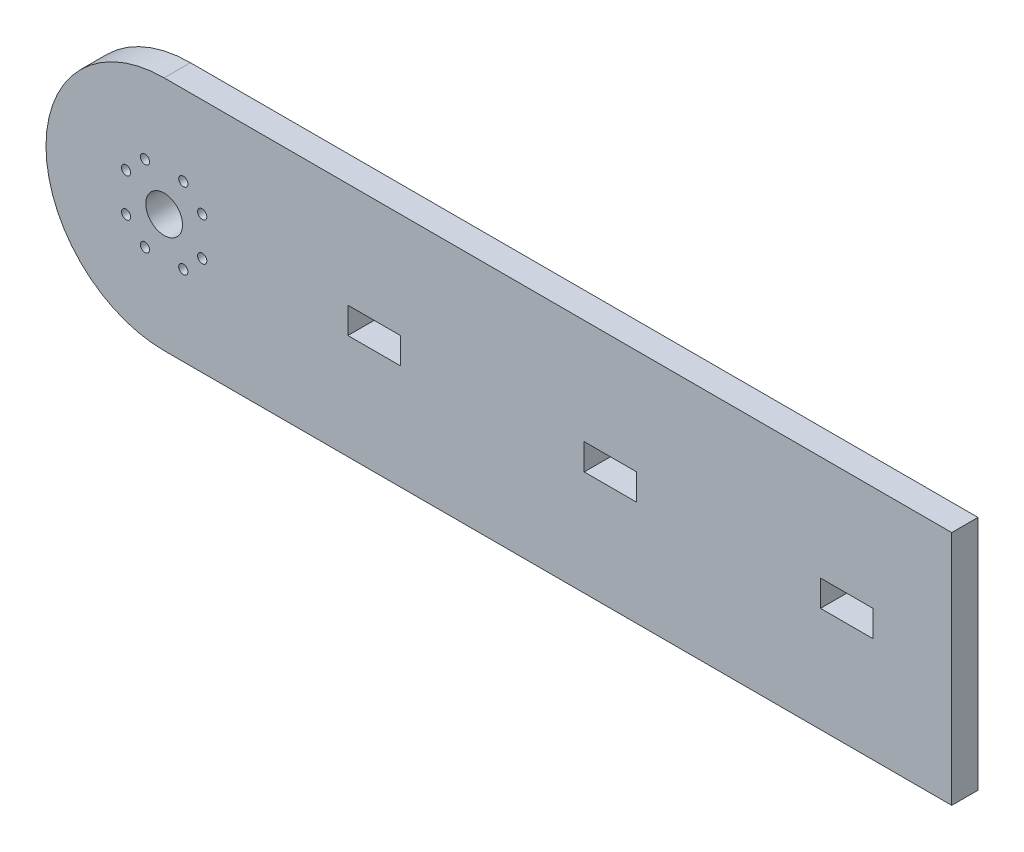
ISO-10303-21;
HEADER;
FILE_DESCRIPTION(('STEP AP214'),'2;1');
FILE_NAME('part.step','',(''),(''),'','','');
FILE_SCHEMA(('AUTOMOTIVE_DESIGN { 1 0 10303 214 1 1 1 1 }'));
ENDSEC;
DATA;
#1=APPLICATION_CONTEXT('core data for automotive mechanical design processes');
#2=APPLICATION_PROTOCOL_DEFINITION('international standard','automotive_design',2000,#1);
#3=PRODUCT_CONTEXT('',#1,'mechanical');
#4=PRODUCT('Part','Part','',(#3));
#5=PRODUCT_RELATED_PRODUCT_CATEGORY('part','',(#4));
#6=PRODUCT_DEFINITION_FORMATION('','',#4);
#7=PRODUCT_DEFINITION_CONTEXT('part definition',#1,'design');
#8=PRODUCT_DEFINITION('design','',#6,#7);
#9=PRODUCT_DEFINITION_SHAPE('','',#8);
#10=(LENGTH_UNIT() NAMED_UNIT(*) SI_UNIT(.MILLI.,.METRE.));
#11=(NAMED_UNIT(*) PLANE_ANGLE_UNIT() SI_UNIT($,.RADIAN.));
#12=(NAMED_UNIT(*) SI_UNIT($,.STERADIAN.) SOLID_ANGLE_UNIT());
#13=UNCERTAINTY_MEASURE_WITH_UNIT(LENGTH_MEASURE(1.E-05),#10,'distance_accuracy_value','');
#14=(GEOMETRIC_REPRESENTATION_CONTEXT(3) GLOBAL_UNCERTAINTY_ASSIGNED_CONTEXT((#13)) GLOBAL_UNIT_ASSIGNED_CONTEXT((#10,
#11,#12)) REPRESENTATION_CONTEXT('',''));
#15=CARTESIAN_POINT('',(0.,0.,0.));
#16=DIRECTION('',(0.,0.,1.));
#17=DIRECTION('',(1.,0.,0.));
#18=AXIS2_PLACEMENT_3D('',#15,#16,#17);
#19=CARTESIAN_POINT('',(0.,-22.5,5.));
#20=DIRECTION('',(0.,1.,0.));
#21=DIRECTION('',(0.,0.,1.));
#22=AXIS2_PLACEMENT_3D('',#19,#20,#21);
#23=PLANE('',#22);
#24=DIRECTION('',(1.,0.,0.));
#25=VECTOR('',#24,1.);
#26=CARTESIAN_POINT('',(0.,-22.5,0.));
#27=LINE('',#26,#25);
#28=CARTESIAN_POINT('',(0.,-22.5,0.));
#29=VERTEX_POINT('',#28);
#30=CARTESIAN_POINT('',(150.,-22.5,0.));
#31=VERTEX_POINT('',#30);
#32=EDGE_CURVE('E240',#29,#31,#27,.T.);
#33=ORIENTED_EDGE('',*,*,#32,.T.);
#34=DIRECTION('',(0.,0.,-1.));
#35=VECTOR('',#34,1.);
#36=CARTESIAN_POINT('',(150.,-22.5,5.));
#37=LINE('',#36,#35);
#38=CARTESIAN_POINT('',(150.,-22.5,5.));
#39=VERTEX_POINT('',#38);
#40=EDGE_CURVE('E11',#39,#31,#37,.T.);
#41=ORIENTED_EDGE('',*,*,#40,.F.);
#42=DIRECTION('',(1.,0.,0.));
#43=VECTOR('',#42,1.);
#44=CARTESIAN_POINT('',(0.,-22.5,5.));
#45=LINE('',#44,#43);
#46=CARTESIAN_POINT('',(0.,-22.5,5.));
#47=VERTEX_POINT('',#46);
#48=EDGE_CURVE('E169',#47,#39,#45,.T.);
#49=ORIENTED_EDGE('',*,*,#48,.F.);
#50=DIRECTION('',(0.,0.,-1.));
#51=VECTOR('',#50,1.);
#52=CARTESIAN_POINT('',(0.,-22.5,5.));
#53=LINE('',#52,#51);
#54=EDGE_CURVE('E275',#47,#29,#53,.T.);
#55=ORIENTED_EDGE('',*,*,#54,.T.);
#56=EDGE_LOOP('',(#33,#41,#49,#55));
#57=FACE_BOUND('',#56,.T.);
#58=ADVANCED_FACE('F35',(#57),#23,.F.);
#59=CARTESIAN_POINT('',(150.,0.,5.));
#60=DIRECTION('',(1.,0.,0.));
#61=DIRECTION('',(0.,0.,-1.));
#62=AXIS2_PLACEMENT_3D('',#59,#60,#61);
#63=PLANE('',#62);
#64=DIRECTION('',(0.,-1.,0.));
#65=VECTOR('',#64,1.);
#66=CARTESIAN_POINT('',(150.,0.,0.));
#67=LINE('',#66,#65);
#68=CARTESIAN_POINT('',(150.,22.5,0.));
#69=VERTEX_POINT('',#68);
#70=EDGE_CURVE('E159',#69,#31,#67,.T.);
#71=ORIENTED_EDGE('',*,*,#70,.F.);
#72=DIRECTION('',(0.,0.,-1.));
#73=VECTOR('',#72,1.);
#74=CARTESIAN_POINT('',(150.,22.5,5.));
#75=LINE('',#74,#73);
#76=CARTESIAN_POINT('',(150.,22.5,5.));
#77=VERTEX_POINT('',#76);
#78=EDGE_CURVE('E45',#77,#69,#75,.T.);
#79=ORIENTED_EDGE('',*,*,#78,.F.);
#80=DIRECTION('',(0.,-1.,0.));
#81=VECTOR('',#80,1.);
#82=CARTESIAN_POINT('',(150.,0.,5.));
#83=LINE('',#82,#81);
#84=EDGE_CURVE('E157',#77,#39,#83,.T.);
#85=ORIENTED_EDGE('',*,*,#84,.T.);
#86=ORIENTED_EDGE('',*,*,#40,.T.);
#87=EDGE_LOOP('',(#71,#79,#85,#86));
#88=FACE_BOUND('',#87,.T.);
#89=ADVANCED_FACE('F156',(#88),#63,.T.);
#90=CARTESIAN_POINT('',(0.,22.5,5.));
#91=DIRECTION('',(0.,1.,0.));
#92=DIRECTION('',(0.,0.,1.));
#93=AXIS2_PLACEMENT_3D('',#90,#91,#92);
#94=PLANE('',#93);
#95=DIRECTION('',(1.,0.,0.));
#96=VECTOR('',#95,1.);
#97=CARTESIAN_POINT('',(0.,22.5,0.));
#98=LINE('',#97,#96);
#99=CARTESIAN_POINT('',(0.,22.5,0.));
#100=VERTEX_POINT('',#99);
#101=EDGE_CURVE('E244',#100,#69,#98,.T.);
#102=ORIENTED_EDGE('',*,*,#101,.F.);
#103=DIRECTION('',(0.,0.,-1.));
#104=VECTOR('',#103,1.);
#105=CARTESIAN_POINT('',(0.,22.5,5.));
#106=LINE('',#105,#104);
#107=CARTESIAN_POINT('',(0.,22.5,5.));
#108=VERTEX_POINT('',#107);
#109=EDGE_CURVE('E105',#108,#100,#106,.T.);
#110=ORIENTED_EDGE('',*,*,#109,.F.);
#111=DIRECTION('',(1.,0.,0.));
#112=VECTOR('',#111,1.);
#113=CARTESIAN_POINT('',(0.,22.5,5.));
#114=LINE('',#113,#112);
#115=EDGE_CURVE('E167',#108,#77,#114,.T.);
#116=ORIENTED_EDGE('',*,*,#115,.T.);
#117=ORIENTED_EDGE('',*,*,#78,.T.);
#118=EDGE_LOOP('',(#102,#110,#116,#117));
#119=FACE_BOUND('',#118,.T.);
#120=ADVANCED_FACE('F172',(#119),#94,.T.);
#121=CARTESIAN_POINT('',(0.,-2.5,5.));
#122=DIRECTION('',(0.,1.,0.));
#123=DIRECTION('',(0.,0.,1.));
#124=AXIS2_PLACEMENT_3D('',#121,#122,#123);
#125=PLANE('',#124);
#126=DIRECTION('',(1.,0.,0.));
#127=VECTOR('',#126,1.);
#128=CARTESIAN_POINT('',(0.,-2.5,0.));
#129=LINE('',#128,#127);
#130=CARTESIAN_POINT('',(125.,-2.5,0.));
#131=VERTEX_POINT('',#130);
#132=CARTESIAN_POINT('',(135.,-2.5,0.));
#133=VERTEX_POINT('',#132);
#134=EDGE_CURVE('E228',#131,#133,#129,.T.);
#135=ORIENTED_EDGE('',*,*,#134,.F.);
#136=DIRECTION('',(0.,0.,-1.));
#137=VECTOR('',#136,1.);
#138=CARTESIAN_POINT('',(125.,-2.5,5.));
#139=LINE('',#138,#137);
#140=CARTESIAN_POINT('',(125.,-2.5,5.));
#141=VERTEX_POINT('',#140);
#142=EDGE_CURVE('E277',#141,#131,#139,.T.);
#143=ORIENTED_EDGE('',*,*,#142,.F.);
#144=DIRECTION('',(1.,0.,0.));
#145=VECTOR('',#144,1.);
#146=CARTESIAN_POINT('',(0.,-2.5,5.));
#147=LINE('',#146,#145);
#148=CARTESIAN_POINT('',(135.,-2.5,5.));
#149=VERTEX_POINT('',#148);
#150=EDGE_CURVE('E337',#141,#149,#147,.T.);
#151=ORIENTED_EDGE('',*,*,#150,.T.);
#152=DIRECTION('',(0.,0.,-1.));
#153=VECTOR('',#152,1.);
#154=CARTESIAN_POINT('',(135.,-2.5,5.));
#155=LINE('',#154,#153);
#156=EDGE_CURVE('E279',#149,#133,#155,.T.);
#157=ORIENTED_EDGE('',*,*,#156,.T.);
#158=EDGE_LOOP('',(#135,#143,#151,#157));
#159=FACE_BOUND('',#158,.T.);
#160=ADVANCED_FACE('F357',(#159),#125,.T.);
#161=CARTESIAN_POINT('',(125.,0.,5.));
#162=DIRECTION('',(1.,0.,0.));
#163=DIRECTION('',(0.,0.,-1.));
#164=AXIS2_PLACEMENT_3D('',#161,#162,#163);
#165=PLANE('',#164);
#166=DIRECTION('',(0.,-1.,0.));
#167=VECTOR('',#166,1.);
#168=CARTESIAN_POINT('',(125.,0.,0.));
#169=LINE('',#168,#167);
#170=CARTESIAN_POINT('',(125.,2.5,0.));
#171=VERTEX_POINT('',#170);
#172=EDGE_CURVE('E231',#171,#131,#169,.T.);
#173=ORIENTED_EDGE('',*,*,#172,.F.);
#174=DIRECTION('',(0.,0.,-1.));
#175=VECTOR('',#174,1.);
#176=CARTESIAN_POINT('',(125.,2.5,5.));
#177=LINE('',#176,#175);
#178=CARTESIAN_POINT('',(125.,2.5,5.));
#179=VERTEX_POINT('',#178);
#180=EDGE_CURVE('E285',#179,#171,#177,.T.);
#181=ORIENTED_EDGE('',*,*,#180,.F.);
#182=DIRECTION('',(0.,-1.,0.));
#183=VECTOR('',#182,1.);
#184=CARTESIAN_POINT('',(125.,0.,5.));
#185=LINE('',#184,#183);
#186=EDGE_CURVE('E340',#179,#141,#185,.T.);
#187=ORIENTED_EDGE('',*,*,#186,.T.);
#188=ORIENTED_EDGE('',*,*,#142,.T.);
#189=EDGE_LOOP('',(#173,#181,#187,#188));
#190=FACE_BOUND('',#189,.T.);
#191=ADVANCED_FACE('F360',(#190),#165,.T.);
#192=CARTESIAN_POINT('',(0.,2.5,5.));
#193=DIRECTION('',(0.,1.,0.));
#194=DIRECTION('',(0.,0.,1.));
#195=AXIS2_PLACEMENT_3D('',#192,#193,#194);
#196=PLANE('',#195);
#197=DIRECTION('',(1.,0.,0.));
#198=VECTOR('',#197,1.);
#199=CARTESIAN_POINT('',(0.,2.5,0.));
#200=LINE('',#199,#198);
#201=CARTESIAN_POINT('',(135.,2.5,0.));
#202=VERTEX_POINT('',#201);
#203=EDGE_CURVE('E234',#171,#202,#200,.T.);
#204=ORIENTED_EDGE('',*,*,#203,.T.);
#205=DIRECTION('',(0.,0.,-1.));
#206=VECTOR('',#205,1.);
#207=CARTESIAN_POINT('',(135.,2.5,5.));
#208=LINE('',#207,#206);
#209=CARTESIAN_POINT('',(135.,2.5,5.));
#210=VERTEX_POINT('',#209);
#211=EDGE_CURVE('E281',#210,#202,#208,.T.);
#212=ORIENTED_EDGE('',*,*,#211,.F.);
#213=DIRECTION('',(1.,0.,0.));
#214=VECTOR('',#213,1.);
#215=CARTESIAN_POINT('',(0.,2.5,5.));
#216=LINE('',#215,#214);
#217=EDGE_CURVE('E343',#179,#210,#216,.T.);
#218=ORIENTED_EDGE('',*,*,#217,.F.);
#219=ORIENTED_EDGE('',*,*,#180,.T.);
#220=EDGE_LOOP('',(#204,#212,#218,#219));
#221=FACE_BOUND('',#220,.T.);
#222=ADVANCED_FACE('F363',(#221),#196,.F.);
#223=CARTESIAN_POINT('',(0.,-2.5,5.));
#224=DIRECTION('',(0.,1.,0.));
#225=DIRECTION('',(0.,0.,1.));
#226=AXIS2_PLACEMENT_3D('',#223,#224,#225);
#227=PLANE('',#226);
#228=DIRECTION('',(1.,0.,0.));
#229=VECTOR('',#228,1.);
#230=CARTESIAN_POINT('',(0.,-2.5,0.));
#231=LINE('',#230,#229);
#232=CARTESIAN_POINT('',(80.,-2.5,0.));
#233=VERTEX_POINT('',#232);
#234=CARTESIAN_POINT('',(90.,-2.5,0.));
#235=VERTEX_POINT('',#234);
#236=EDGE_CURVE('E216',#233,#235,#231,.T.);
#237=ORIENTED_EDGE('',*,*,#236,.F.);
#238=DIRECTION('',(0.,0.,-1.));
#239=VECTOR('',#238,1.);
#240=CARTESIAN_POINT('',(80.,-2.5,5.));
#241=LINE('',#240,#239);
#242=CARTESIAN_POINT('',(80.,-2.5,5.));
#243=VERTEX_POINT('',#242);
#244=EDGE_CURVE('E282',#243,#233,#241,.T.);
#245=ORIENTED_EDGE('',*,*,#244,.F.);
#246=DIRECTION('',(1.,0.,0.));
#247=VECTOR('',#246,1.);
#248=CARTESIAN_POINT('',(0.,-2.5,5.));
#249=LINE('',#248,#247);
#250=CARTESIAN_POINT('',(90.,-2.5,5.));
#251=VERTEX_POINT('',#250);
#252=EDGE_CURVE('E321',#243,#251,#249,.T.);
#253=ORIENTED_EDGE('',*,*,#252,.T.);
#254=DIRECTION('',(0.,0.,-1.));
#255=VECTOR('',#254,1.);
#256=CARTESIAN_POINT('',(90.,-2.5,5.));
#257=LINE('',#256,#255);
#258=EDGE_CURVE('E288',#251,#235,#257,.T.);
#259=ORIENTED_EDGE('',*,*,#258,.T.);
#260=EDGE_LOOP('',(#237,#245,#253,#259));
#261=FACE_BOUND('',#260,.T.);
#262=ADVANCED_FACE('F415',(#261),#227,.T.);
#263=CARTESIAN_POINT('',(80.,0.,5.));
#264=DIRECTION('',(1.,0.,0.));
#265=DIRECTION('',(0.,0.,-1.));
#266=AXIS2_PLACEMENT_3D('',#263,#264,#265);
#267=PLANE('',#266);
#268=DIRECTION('',(0.,-1.,0.));
#269=VECTOR('',#268,1.);
#270=CARTESIAN_POINT('',(80.,0.,0.));
#271=LINE('',#270,#269);
#272=CARTESIAN_POINT('',(80.,2.5,0.));
#273=VERTEX_POINT('',#272);
#274=EDGE_CURVE('E219',#273,#233,#271,.T.);
#275=ORIENTED_EDGE('',*,*,#274,.F.);
#276=DIRECTION('',(0.,0.,-1.));
#277=VECTOR('',#276,1.);
#278=CARTESIAN_POINT('',(80.,2.5,5.));
#279=LINE('',#278,#277);
#280=CARTESIAN_POINT('',(80.,2.5,5.));
#281=VERTEX_POINT('',#280);
#282=EDGE_CURVE('E293',#281,#273,#279,.T.);
#283=ORIENTED_EDGE('',*,*,#282,.F.);
#284=DIRECTION('',(0.,-1.,0.));
#285=VECTOR('',#284,1.);
#286=CARTESIAN_POINT('',(80.,0.,5.));
#287=LINE('',#286,#285);
#288=EDGE_CURVE('E325',#281,#243,#287,.T.);
#289=ORIENTED_EDGE('',*,*,#288,.T.);
#290=ORIENTED_EDGE('',*,*,#244,.T.);
#291=EDGE_LOOP('',(#275,#283,#289,#290));
#292=FACE_BOUND('',#291,.T.);
#293=ADVANCED_FACE('F426',(#292),#267,.T.);
#294=CARTESIAN_POINT('',(0.,2.5,5.));
#295=DIRECTION('',(0.,1.,0.));
#296=DIRECTION('',(0.,0.,1.));
#297=AXIS2_PLACEMENT_3D('',#294,#295,#296);
#298=PLANE('',#297);
#299=DIRECTION('',(1.,0.,0.));
#300=VECTOR('',#299,1.);
#301=CARTESIAN_POINT('',(0.,2.5,0.));
#302=LINE('',#301,#300);
#303=CARTESIAN_POINT('',(90.,2.5,0.));
#304=VERTEX_POINT('',#303);
#305=EDGE_CURVE('E222',#273,#304,#302,.T.);
#306=ORIENTED_EDGE('',*,*,#305,.T.);
#307=DIRECTION('',(0.,0.,-1.));
#308=VECTOR('',#307,1.);
#309=CARTESIAN_POINT('',(90.,2.5,5.));
#310=LINE('',#309,#308);
#311=CARTESIAN_POINT('',(90.,2.5,5.));
#312=VERTEX_POINT('',#311);
#313=EDGE_CURVE('E290',#312,#304,#310,.T.);
#314=ORIENTED_EDGE('',*,*,#313,.F.);
#315=DIRECTION('',(1.,0.,0.));
#316=VECTOR('',#315,1.);
#317=CARTESIAN_POINT('',(0.,2.5,5.));
#318=LINE('',#317,#316);
#319=EDGE_CURVE('E332',#281,#312,#318,.T.);
#320=ORIENTED_EDGE('',*,*,#319,.F.);
#321=ORIENTED_EDGE('',*,*,#282,.T.);
#322=EDGE_LOOP('',(#306,#314,#320,#321));
#323=FACE_BOUND('',#322,.T.);
#324=ADVANCED_FACE('F423',(#323),#298,.F.);
#325=CARTESIAN_POINT('',(0.,-2.5,5.));
#326=DIRECTION('',(0.,1.,0.));
#327=DIRECTION('',(0.,0.,1.));
#328=AXIS2_PLACEMENT_3D('',#325,#326,#327);
#329=PLANE('',#328);
#330=DIRECTION('',(1.,0.,0.));
#331=VECTOR('',#330,1.);
#332=CARTESIAN_POINT('',(0.,-2.5,0.));
#333=LINE('',#332,#331);
#334=CARTESIAN_POINT('',(35.,-2.5,0.));
#335=VERTEX_POINT('',#334);
#336=CARTESIAN_POINT('',(45.,-2.5,0.));
#337=VERTEX_POINT('',#336);
#338=EDGE_CURVE('E205',#335,#337,#333,.T.);
#339=ORIENTED_EDGE('',*,*,#338,.F.);
#340=DIRECTION('',(0.,0.,-1.));
#341=VECTOR('',#340,1.);
#342=CARTESIAN_POINT('',(35.,-2.5,5.));
#343=LINE('',#342,#341);
#344=CARTESIAN_POINT('',(35.,-2.5,5.));
#345=VERTEX_POINT('',#344);
#346=EDGE_CURVE('E39',#345,#335,#343,.T.);
#347=ORIENTED_EDGE('',*,*,#346,.F.);
#348=DIRECTION('',(1.,0.,0.));
#349=VECTOR('',#348,1.);
#350=CARTESIAN_POINT('',(0.,-2.5,5.));
#351=LINE('',#350,#349);
#352=CARTESIAN_POINT('',(45.,-2.5,5.));
#353=VERTEX_POINT('',#352);
#354=EDGE_CURVE('E274',#345,#353,#351,.T.);
#355=ORIENTED_EDGE('',*,*,#354,.T.);
#356=DIRECTION('',(0.,0.,-1.));
#357=VECTOR('',#356,1.);
#358=CARTESIAN_POINT('',(45.,-2.5,5.));
#359=LINE('',#358,#357);
#360=EDGE_CURVE('E204',#353,#337,#359,.T.);
#361=ORIENTED_EDGE('',*,*,#360,.T.);
#362=EDGE_LOOP('',(#339,#347,#355,#361));
#363=FACE_BOUND('',#362,.T.);
#364=ADVANCED_FACE('F37',(#363),#329,.T.);
#365=CARTESIAN_POINT('',(35.,0.,5.));
#366=DIRECTION('',(1.,0.,0.));
#367=DIRECTION('',(0.,0.,-1.));
#368=AXIS2_PLACEMENT_3D('',#365,#366,#367);
#369=PLANE('',#368);
#370=DIRECTION('',(0.,-1.,0.));
#371=VECTOR('',#370,1.);
#372=CARTESIAN_POINT('',(35.,0.,0.));
#373=LINE('',#372,#371);
#374=CARTESIAN_POINT('',(35.,2.5,0.));
#375=VERTEX_POINT('',#374);
#376=EDGE_CURVE('E208',#375,#335,#373,.T.);
#377=ORIENTED_EDGE('',*,*,#376,.F.);
#378=DIRECTION('',(0.,0.,-1.));
#379=VECTOR('',#378,1.);
#380=CARTESIAN_POINT('',(35.,2.5,5.));
#381=LINE('',#380,#379);
#382=CARTESIAN_POINT('',(35.,2.5,5.));
#383=VERTEX_POINT('',#382);
#384=EDGE_CURVE('E299',#383,#375,#381,.T.);
#385=ORIENTED_EDGE('',*,*,#384,.F.);
#386=DIRECTION('',(0.,-1.,0.));
#387=VECTOR('',#386,1.);
#388=CARTESIAN_POINT('',(35.,0.,5.));
#389=LINE('',#388,#387);
#390=EDGE_CURVE('E308',#383,#345,#389,.T.);
#391=ORIENTED_EDGE('',*,*,#390,.T.);
#392=ORIENTED_EDGE('',*,*,#346,.T.);
#393=EDGE_LOOP('',(#377,#385,#391,#392));
#394=FACE_BOUND('',#393,.T.);
#395=ADVANCED_FACE('F306',(#394),#369,.T.);
#396=CARTESIAN_POINT('',(0.,2.5,5.));
#397=DIRECTION('',(0.,1.,0.));
#398=DIRECTION('',(0.,0.,1.));
#399=AXIS2_PLACEMENT_3D('',#396,#397,#398);
#400=PLANE('',#399);
#401=DIRECTION('',(1.,0.,0.));
#402=VECTOR('',#401,1.);
#403=CARTESIAN_POINT('',(0.,2.5,0.));
#404=LINE('',#403,#402);
#405=CARTESIAN_POINT('',(45.,2.5,0.));
#406=VERTEX_POINT('',#405);
#407=EDGE_CURVE('E211',#375,#406,#404,.T.);
#408=ORIENTED_EDGE('',*,*,#407,.T.);
#409=DIRECTION('',(0.,0.,-1.));
#410=VECTOR('',#409,1.);
#411=CARTESIAN_POINT('',(45.,2.5,5.));
#412=LINE('',#411,#410);
#413=CARTESIAN_POINT('',(45.,2.5,5.));
#414=VERTEX_POINT('',#413);
#415=EDGE_CURVE('E297',#414,#406,#412,.T.);
#416=ORIENTED_EDGE('',*,*,#415,.F.);
#417=DIRECTION('',(1.,0.,0.));
#418=VECTOR('',#417,1.);
#419=CARTESIAN_POINT('',(0.,2.5,5.));
#420=LINE('',#419,#418);
#421=EDGE_CURVE('E322',#383,#414,#420,.T.);
#422=ORIENTED_EDGE('',*,*,#421,.F.);
#423=ORIENTED_EDGE('',*,*,#384,.T.);
#424=EDGE_LOOP('',(#408,#416,#422,#423));
#425=FACE_BOUND('',#424,.T.);
#426=ADVANCED_FACE('F315',(#425),#400,.F.);
#427=CARTESIAN_POINT('',(-3.64999999999992,7.25000000000004,5.));
#428=DIRECTION('',(0.,0.,-1.));
#429=DIRECTION('',(-1.,0.,0.));
#430=AXIS2_PLACEMENT_3D('',#427,#428,#429);
#431=CYLINDRICAL_SURFACE('',#430,0.875);
#432=CARTESIAN_POINT('',(-3.64999999999992,7.25000000000004,5.));
#433=DIRECTION('',(0.,0.,1.));
#434=DIRECTION('',(1.,0.,0.));
#435=AXIS2_PLACEMENT_3D('',#432,#433,#434);
#436=CIRCLE('',#435,0.875);
#437=CARTESIAN_POINT('',(-2.77499999999992,7.25000000000004,5.));
#438=VERTEX_POINT('',#437);
#439=EDGE_CURVE('E198',#438,#438,#436,.T.);
#440=ORIENTED_EDGE('',*,*,#439,.T.);
#441=EDGE_LOOP('',(#440));
#442=FACE_BOUND('',#441,.T.);
#443=CARTESIAN_POINT('',(-3.64999999999992,7.25000000000004,0.));
#444=DIRECTION('',(0.,0.,1.));
#445=DIRECTION('',(1.,0.,0.));
#446=AXIS2_PLACEMENT_3D('',#443,#444,#445);
#447=CIRCLE('',#446,0.875);
#448=CARTESIAN_POINT('',(-2.77499999999992,7.25000000000004,0.));
#449=VERTEX_POINT('',#448);
#450=EDGE_CURVE('E268',#449,#449,#447,.T.);
#451=ORIENTED_EDGE('',*,*,#450,.F.);
#452=EDGE_LOOP('',(#451));
#453=FACE_BOUND('',#452,.T.);
#454=ADVANCED_FACE('F435',(#442,#453),#431,.F.);
#455=CARTESIAN_POINT('',(-3.65000000000003,-7.24999999999999,5.));
#456=DIRECTION('',(0.,0.,-1.));
#457=DIRECTION('',(-1.,0.,0.));
#458=AXIS2_PLACEMENT_3D('',#455,#456,#457);
#459=CYLINDRICAL_SURFACE('',#458,0.874999999999999);
#460=CARTESIAN_POINT('',(-3.65000000000003,-7.24999999999999,5.));
#461=DIRECTION('',(0.,0.,1.));
#462=DIRECTION('',(1.,0.,0.));
#463=AXIS2_PLACEMENT_3D('',#460,#461,#462);
#464=CIRCLE('',#463,0.874999999999999);
#465=CARTESIAN_POINT('',(-2.77500000000003,-7.24999999999999,5.));
#466=VERTEX_POINT('',#465);
#467=EDGE_CURVE('E195',#466,#466,#464,.F.);
#468=ORIENTED_EDGE('',*,*,#467,.F.);
#469=EDGE_LOOP('',(#468));
#470=FACE_BOUND('',#469,.T.);
#471=CARTESIAN_POINT('',(-3.65000000000003,-7.24999999999999,0.));
#472=DIRECTION('',(0.,0.,1.));
#473=DIRECTION('',(1.,0.,0.));
#474=AXIS2_PLACEMENT_3D('',#471,#472,#473);
#475=CIRCLE('',#474,0.874999999999999);
#476=CARTESIAN_POINT('',(-2.77500000000003,-7.24999999999999,0.));
#477=VERTEX_POINT('',#476);
#478=EDGE_CURVE('E265',#477,#477,#475,.F.);
#479=ORIENTED_EDGE('',*,*,#478,.T.);
#480=EDGE_LOOP('',(#479));
#481=FACE_BOUND('',#480,.T.);
#482=ADVANCED_FACE('F514',(#470,#481),#459,.F.);
#483=CARTESIAN_POINT('',(3.64999999999998,-7.25000000000001,5.));
#484=DIRECTION('',(0.,0.,-1.));
#485=DIRECTION('',(-1.,0.,0.));
#486=AXIS2_PLACEMENT_3D('',#483,#484,#485);
#487=CYLINDRICAL_SURFACE('',#486,0.874999999999999);
#488=CARTESIAN_POINT('',(3.64999999999998,-7.25000000000001,5.));
#489=DIRECTION('',(0.,0.,1.));
#490=DIRECTION('',(1.,0.,0.));
#491=AXIS2_PLACEMENT_3D('',#488,#489,#490);
#492=CIRCLE('',#491,0.874999999999999);
#493=CARTESIAN_POINT('',(4.52499999999997,-7.25000000000001,5.));
#494=VERTEX_POINT('',#493);
#495=EDGE_CURVE('E192',#494,#494,#492,.T.);
#496=ORIENTED_EDGE('',*,*,#495,.T.);
#497=EDGE_LOOP('',(#496));
#498=FACE_BOUND('',#497,.T.);
#499=CARTESIAN_POINT('',(3.64999999999998,-7.25000000000001,0.));
#500=DIRECTION('',(0.,0.,1.));
#501=DIRECTION('',(1.,0.,0.));
#502=AXIS2_PLACEMENT_3D('',#499,#500,#501);
#503=CIRCLE('',#502,0.874999999999999);
#504=CARTESIAN_POINT('',(4.52499999999997,-7.25000000000001,0.));
#505=VERTEX_POINT('',#504);
#506=EDGE_CURVE('E262',#505,#505,#503,.T.);
#507=ORIENTED_EDGE('',*,*,#506,.F.);
#508=EDGE_LOOP('',(#507));
#509=FACE_BOUND('',#508,.T.);
#510=ADVANCED_FACE('F522',(#498,#509),#487,.F.);
#511=CARTESIAN_POINT('',(0.,0.,5.));
#512=DIRECTION('',(0.,0.,-1.));
#513=DIRECTION('',(-1.,0.,0.));
#514=AXIS2_PLACEMENT_3D('',#511,#512,#513);
#515=CYLINDRICAL_SURFACE('',#514,3.5);
#516=CARTESIAN_POINT('',(0.,0.,5.));
#517=DIRECTION('',(0.,0.,1.));
#518=DIRECTION('',(1.,0.,0.));
#519=AXIS2_PLACEMENT_3D('',#516,#517,#518);
#520=CIRCLE('',#519,3.5);
#521=CARTESIAN_POINT('',(3.5,0.,5.));
#522=VERTEX_POINT('',#521);
#523=EDGE_CURVE('E189',#522,#522,#520,.T.);
#524=ORIENTED_EDGE('',*,*,#523,.T.);
#525=EDGE_LOOP('',(#524));
#526=FACE_BOUND('',#525,.T.);
#527=CARTESIAN_POINT('',(0.,0.,0.));
#528=DIRECTION('',(0.,0.,1.));
#529=DIRECTION('',(1.,0.,0.));
#530=AXIS2_PLACEMENT_3D('',#527,#528,#529);
#531=CIRCLE('',#530,3.5);
#532=CARTESIAN_POINT('',(3.5,0.,0.));
#533=VERTEX_POINT('',#532);
#534=EDGE_CURVE('E259',#533,#533,#531,.T.);
#535=ORIENTED_EDGE('',*,*,#534,.F.);
#536=EDGE_LOOP('',(#535));
#537=FACE_BOUND('',#536,.T.);
#538=ADVANCED_FACE('F531',(#526,#537),#515,.F.);
#539=CARTESIAN_POINT('',(7.25,3.65,5.));
#540=DIRECTION('',(0.,0.,-1.));
#541=DIRECTION('',(-1.,0.,0.));
#542=AXIS2_PLACEMENT_3D('',#539,#540,#541);
#543=CYLINDRICAL_SURFACE('',#542,0.874999999999999);
#544=CARTESIAN_POINT('',(7.25,3.65,5.));
#545=DIRECTION('',(0.,0.,1.));
#546=DIRECTION('',(1.,0.,0.));
#547=AXIS2_PLACEMENT_3D('',#544,#545,#546);
#548=CIRCLE('',#547,0.874999999999999);
#549=CARTESIAN_POINT('',(8.125,3.65,5.));
#550=VERTEX_POINT('',#549);
#551=EDGE_CURVE('E186',#550,#550,#548,.T.);
#552=ORIENTED_EDGE('',*,*,#551,.T.);
#553=EDGE_LOOP('',(#552));
#554=FACE_BOUND('',#553,.T.);
#555=CARTESIAN_POINT('',(7.25,3.65,0.));
#556=DIRECTION('',(0.,0.,1.));
#557=DIRECTION('',(1.,0.,0.));
#558=AXIS2_PLACEMENT_3D('',#555,#556,#557);
#559=CIRCLE('',#558,0.874999999999999);
#560=CARTESIAN_POINT('',(8.125,3.65,0.));
#561=VERTEX_POINT('',#560);
#562=EDGE_CURVE('E256',#561,#561,#559,.T.);
#563=ORIENTED_EDGE('',*,*,#562,.F.);
#564=EDGE_LOOP('',(#563));
#565=FACE_BOUND('',#564,.T.);
#566=ADVANCED_FACE('F540',(#554,#565),#543,.F.);
#567=CARTESIAN_POINT('',(7.25,-3.65,5.));
#568=DIRECTION('',(0.,0.,-1.));
#569=DIRECTION('',(-1.,0.,0.));
#570=AXIS2_PLACEMENT_3D('',#567,#568,#569);
#571=CYLINDRICAL_SURFACE('',#570,0.874999999999999);
#572=CARTESIAN_POINT('',(7.25,-3.65,5.));
#573=DIRECTION('',(0.,0.,1.));
#574=DIRECTION('',(1.,0.,0.));
#575=AXIS2_PLACEMENT_3D('',#572,#573,#574);
#576=CIRCLE('',#575,0.874999999999999);
#577=CARTESIAN_POINT('',(8.125,-3.65,5.));
#578=VERTEX_POINT('',#577);
#579=EDGE_CURVE('E183',#578,#578,#576,.F.);
#580=ORIENTED_EDGE('',*,*,#579,.F.);
#581=EDGE_LOOP('',(#580));
#582=FACE_BOUND('',#581,.T.);
#583=CARTESIAN_POINT('',(7.25,-3.65,0.));
#584=DIRECTION('',(0.,0.,1.));
#585=DIRECTION('',(1.,0.,0.));
#586=AXIS2_PLACEMENT_3D('',#583,#584,#585);
#587=CIRCLE('',#586,0.874999999999999);
#588=CARTESIAN_POINT('',(8.125,-3.65,0.));
#589=VERTEX_POINT('',#588);
#590=EDGE_CURVE('E253',#589,#589,#587,.F.);
#591=ORIENTED_EDGE('',*,*,#590,.T.);
#592=EDGE_LOOP('',(#591));
#593=FACE_BOUND('',#592,.T.);
#594=ADVANCED_FACE('F549',(#582,#593),#571,.F.);
#595=CARTESIAN_POINT('',(-7.25000000000002,-3.64999999999995,5.));
#596=DIRECTION('',(0.,0.,-1.));
#597=DIRECTION('',(-1.,0.,0.));
#598=AXIS2_PLACEMENT_3D('',#595,#596,#597);
#599=CYLINDRICAL_SURFACE('',#598,0.875);
#600=CARTESIAN_POINT('',(-7.25000000000002,-3.64999999999995,5.));
#601=DIRECTION('',(0.,0.,1.));
#602=DIRECTION('',(1.,0.,0.));
#603=AXIS2_PLACEMENT_3D('',#600,#601,#602);
#604=CIRCLE('',#603,0.875);
#605=CARTESIAN_POINT('',(-6.37500000000002,-3.64999999999995,5.));
#606=VERTEX_POINT('',#605);
#607=EDGE_CURVE('E180',#606,#606,#604,.T.);
#608=ORIENTED_EDGE('',*,*,#607,.T.);
#609=EDGE_LOOP('',(#608));
#610=FACE_BOUND('',#609,.T.);
#611=CARTESIAN_POINT('',(-7.25000000000002,-3.64999999999995,0.));
#612=DIRECTION('',(0.,0.,1.));
#613=DIRECTION('',(1.,0.,0.));
#614=AXIS2_PLACEMENT_3D('',#611,#612,#613);
#615=CIRCLE('',#614,0.875);
#616=CARTESIAN_POINT('',(-6.37500000000002,-3.64999999999995,0.));
#617=VERTEX_POINT('',#616);
#618=EDGE_CURVE('E250',#617,#617,#615,.T.);
#619=ORIENTED_EDGE('',*,*,#618,.F.);
#620=EDGE_LOOP('',(#619));
#621=FACE_BOUND('',#620,.T.);
#622=ADVANCED_FACE('F558',(#610,#621),#599,.F.);
#623=CARTESIAN_POINT('',(-7.24999999999997,3.65000000000005,5.));
#624=DIRECTION('',(0.,0.,-1.));
#625=DIRECTION('',(-1.,0.,0.));
#626=AXIS2_PLACEMENT_3D('',#623,#624,#625);
#627=CYLINDRICAL_SURFACE('',#626,0.874999999999998);
#628=CARTESIAN_POINT('',(-7.24999999999997,3.65000000000005,5.));
#629=DIRECTION('',(0.,0.,1.));
#630=DIRECTION('',(1.,0.,0.));
#631=AXIS2_PLACEMENT_3D('',#628,#629,#630);
#632=CIRCLE('',#631,0.874999999999998);
#633=CARTESIAN_POINT('',(-6.37499999999998,3.65000000000005,5.));
#634=VERTEX_POINT('',#633);
#635=EDGE_CURVE('E174',#634,#634,#632,.F.);
#636=ORIENTED_EDGE('',*,*,#635,.F.);
#637=EDGE_LOOP('',(#636));
#638=FACE_BOUND('',#637,.T.);
#639=CARTESIAN_POINT('',(-7.24999999999997,3.65000000000005,0.));
#640=DIRECTION('',(0.,0.,1.));
#641=DIRECTION('',(1.,0.,0.));
#642=AXIS2_PLACEMENT_3D('',#639,#640,#641);
#643=CIRCLE('',#642,0.874999999999998);
#644=CARTESIAN_POINT('',(-6.37499999999998,3.65000000000005,0.));
#645=VERTEX_POINT('',#644);
#646=EDGE_CURVE('E247',#645,#645,#643,.F.);
#647=ORIENTED_EDGE('',*,*,#646,.T.);
#648=EDGE_LOOP('',(#647));
#649=FACE_BOUND('',#648,.T.);
#650=ADVANCED_FACE('F570',(#638,#649),#627,.F.);
#651=CARTESIAN_POINT('',(0.,0.,5.));
#652=DIRECTION('',(0.,0.,-1.));
#653=DIRECTION('',(-1.,0.,0.));
#654=AXIS2_PLACEMENT_3D('',#651,#652,#653);
#655=CYLINDRICAL_SURFACE('',#654,22.5);
#656=CARTESIAN_POINT('',(0.,0.,0.));
#657=DIRECTION('',(0.,0.,1.));
#658=DIRECTION('',(1.,0.,0.));
#659=AXIS2_PLACEMENT_3D('',#656,#657,#658);
#660=CIRCLE('',#659,22.5);
#661=EDGE_CURVE('E108',#100,#29,#660,.T.);
#662=ORIENTED_EDGE('',*,*,#661,.T.);
#663=ORIENTED_EDGE('',*,*,#54,.F.);
#664=CARTESIAN_POINT('',(0.,0.,5.));
#665=DIRECTION('',(0.,0.,1.));
#666=DIRECTION('',(1.,0.,0.));
#667=AXIS2_PLACEMENT_3D('',#664,#665,#666);
#668=CIRCLE('',#667,22.5);
#669=EDGE_CURVE('E54',#108,#47,#668,.T.);
#670=ORIENTED_EDGE('',*,*,#669,.F.);
#671=ORIENTED_EDGE('',*,*,#109,.T.);
#672=EDGE_LOOP('',(#662,#663,#670,#671));
#673=FACE_BOUND('',#672,.T.);
#674=ADVANCED_FACE('F412',(#673),#655,.T.);
#675=CARTESIAN_POINT('',(135.,0.,5.));
#676=DIRECTION('',(1.,0.,0.));
#677=DIRECTION('',(0.,0.,-1.));
#678=AXIS2_PLACEMENT_3D('',#675,#676,#677);
#679=PLANE('',#678);
#680=DIRECTION('',(0.,-1.,0.));
#681=VECTOR('',#680,1.);
#682=CARTESIAN_POINT('',(135.,0.,0.));
#683=LINE('',#682,#681);
#684=EDGE_CURVE('E237',#202,#133,#683,.T.);
#685=ORIENTED_EDGE('',*,*,#684,.T.);
#686=ORIENTED_EDGE('',*,*,#156,.F.);
#687=DIRECTION('',(0.,-1.,0.));
#688=VECTOR('',#687,1.);
#689=CARTESIAN_POINT('',(135.,0.,5.));
#690=LINE('',#689,#688);
#691=EDGE_CURVE('E346',#210,#149,#690,.T.);
#692=ORIENTED_EDGE('',*,*,#691,.F.);
#693=ORIENTED_EDGE('',*,*,#211,.T.);
#694=EDGE_LOOP('',(#685,#686,#692,#693));
#695=FACE_BOUND('',#694,.T.);
#696=ADVANCED_FACE('F354',(#695),#679,.F.);
#697=CARTESIAN_POINT('',(90.,0.,5.));
#698=DIRECTION('',(1.,0.,0.));
#699=DIRECTION('',(0.,0.,-1.));
#700=AXIS2_PLACEMENT_3D('',#697,#698,#699);
#701=PLANE('',#700);
#702=DIRECTION('',(0.,-1.,0.));
#703=VECTOR('',#702,1.);
#704=CARTESIAN_POINT('',(90.,0.,0.));
#705=LINE('',#704,#703);
#706=EDGE_CURVE('E225',#304,#235,#705,.T.);
#707=ORIENTED_EDGE('',*,*,#706,.T.);
#708=ORIENTED_EDGE('',*,*,#258,.F.);
#709=DIRECTION('',(0.,-1.,0.));
#710=VECTOR('',#709,1.);
#711=CARTESIAN_POINT('',(90.,0.,5.));
#712=LINE('',#711,#710);
#713=EDGE_CURVE('E335',#312,#251,#712,.T.);
#714=ORIENTED_EDGE('',*,*,#713,.F.);
#715=ORIENTED_EDGE('',*,*,#313,.T.);
#716=EDGE_LOOP('',(#707,#708,#714,#715));
#717=FACE_BOUND('',#716,.T.);
#718=ADVANCED_FACE('F397',(#717),#701,.F.);
#719=CARTESIAN_POINT('',(45.,0.,5.));
#720=DIRECTION('',(1.,0.,0.));
#721=DIRECTION('',(0.,0.,-1.));
#722=AXIS2_PLACEMENT_3D('',#719,#720,#721);
#723=PLANE('',#722);
#724=DIRECTION('',(0.,-1.,0.));
#725=VECTOR('',#724,1.);
#726=CARTESIAN_POINT('',(45.,0.,0.));
#727=LINE('',#726,#725);
#728=EDGE_CURVE('E213',#406,#337,#727,.T.);
#729=ORIENTED_EDGE('',*,*,#728,.T.);
#730=ORIENTED_EDGE('',*,*,#360,.F.);
#731=DIRECTION('',(0.,-1.,0.));
#732=VECTOR('',#731,1.);
#733=CARTESIAN_POINT('',(45.,0.,5.));
#734=LINE('',#733,#732);
#735=EDGE_CURVE('E319',#414,#353,#734,.T.);
#736=ORIENTED_EDGE('',*,*,#735,.F.);
#737=ORIENTED_EDGE('',*,*,#415,.T.);
#738=EDGE_LOOP('',(#729,#730,#736,#737));
#739=FACE_BOUND('',#738,.T.);
#740=ADVANCED_FACE('F318',(#739),#723,.F.);
#741=CARTESIAN_POINT('',(3.65000000000008,7.24999999999996,5.));
#742=DIRECTION('',(0.,0.,-1.));
#743=DIRECTION('',(-1.,0.,0.));
#744=AXIS2_PLACEMENT_3D('',#741,#742,#743);
#745=CYLINDRICAL_SURFACE('',#744,0.874999999999998);
#746=CARTESIAN_POINT('',(3.65000000000008,7.24999999999996,5.));
#747=DIRECTION('',(0.,0.,1.));
#748=DIRECTION('',(1.,0.,0.));
#749=AXIS2_PLACEMENT_3D('',#746,#747,#748);
#750=CIRCLE('',#749,0.874999999999998);
#751=CARTESIAN_POINT('',(4.52500000000007,7.24999999999996,5.));
#752=VERTEX_POINT('',#751);
#753=EDGE_CURVE('E201',#752,#752,#750,.F.);
#754=ORIENTED_EDGE('',*,*,#753,.F.);
#755=EDGE_LOOP('',(#754));
#756=FACE_BOUND('',#755,.T.);
#757=CARTESIAN_POINT('',(3.65000000000008,7.24999999999996,0.));
#758=DIRECTION('',(0.,0.,1.));
#759=DIRECTION('',(1.,0.,0.));
#760=AXIS2_PLACEMENT_3D('',#757,#758,#759);
#761=CIRCLE('',#760,0.874999999999998);
#762=CARTESIAN_POINT('',(4.52500000000007,7.24999999999996,0.));
#763=VERTEX_POINT('',#762);
#764=EDGE_CURVE('E271',#763,#763,#761,.F.);
#765=ORIENTED_EDGE('',*,*,#764,.T.);
#766=EDGE_LOOP('',(#765));
#767=FACE_BOUND('',#766,.T.);
#768=ADVANCED_FACE('F388',(#756,#767),#745,.F.);
#769=CARTESIAN_POINT('',(0.,0.,5.));
#770=DIRECTION('',(0.,0.,1.));
#771=DIRECTION('',(1.,0.,0.));
#772=AXIS2_PLACEMENT_3D('',#769,#770,#771);
#773=PLANE('',#772);
#774=ORIENTED_EDGE('',*,*,#354,.F.);
#775=ORIENTED_EDGE('',*,*,#390,.F.);
#776=ORIENTED_EDGE('',*,*,#421,.T.);
#777=ORIENTED_EDGE('',*,*,#735,.T.);
#778=EDGE_LOOP('',(#774,#775,#776,#777));
#779=FACE_BOUND('',#778,.T.);
#780=ORIENTED_EDGE('',*,*,#252,.F.);
#781=ORIENTED_EDGE('',*,*,#288,.F.);
#782=ORIENTED_EDGE('',*,*,#319,.T.);
#783=ORIENTED_EDGE('',*,*,#713,.T.);
#784=EDGE_LOOP('',(#780,#781,#782,#783));
#785=FACE_BOUND('',#784,.T.);
#786=ORIENTED_EDGE('',*,*,#150,.F.);
#787=ORIENTED_EDGE('',*,*,#186,.F.);
#788=ORIENTED_EDGE('',*,*,#217,.T.);
#789=ORIENTED_EDGE('',*,*,#691,.T.);
#790=EDGE_LOOP('',(#786,#787,#788,#789));
#791=FACE_BOUND('',#790,.T.);
#792=ORIENTED_EDGE('',*,*,#48,.T.);
#793=ORIENTED_EDGE('',*,*,#84,.F.);
#794=ORIENTED_EDGE('',*,*,#115,.F.);
#795=ORIENTED_EDGE('',*,*,#669,.T.);
#796=EDGE_LOOP('',(#792,#793,#794,#795));
#797=FACE_BOUND('',#796,.T.);
#798=ORIENTED_EDGE('',*,*,#635,.T.);
#799=EDGE_LOOP('',(#798));
#800=FACE_BOUND('',#799,.T.);
#801=ORIENTED_EDGE('',*,*,#607,.F.);
#802=EDGE_LOOP('',(#801));
#803=FACE_BOUND('',#802,.T.);
#804=ORIENTED_EDGE('',*,*,#579,.T.);
#805=EDGE_LOOP('',(#804));
#806=FACE_BOUND('',#805,.T.);
#807=ORIENTED_EDGE('',*,*,#551,.F.);
#808=EDGE_LOOP('',(#807));
#809=FACE_BOUND('',#808,.T.);
#810=ORIENTED_EDGE('',*,*,#523,.F.);
#811=EDGE_LOOP('',(#810));
#812=FACE_BOUND('',#811,.T.);
#813=ORIENTED_EDGE('',*,*,#495,.F.);
#814=EDGE_LOOP('',(#813));
#815=FACE_BOUND('',#814,.T.);
#816=ORIENTED_EDGE('',*,*,#467,.T.);
#817=EDGE_LOOP('',(#816));
#818=FACE_BOUND('',#817,.T.);
#819=ORIENTED_EDGE('',*,*,#439,.F.);
#820=EDGE_LOOP('',(#819));
#821=FACE_BOUND('',#820,.T.);
#822=ORIENTED_EDGE('',*,*,#753,.T.);
#823=EDGE_LOOP('',(#822));
#824=FACE_BOUND('',#823,.T.);
#825=ADVANCED_FACE('F165',(#779,#785,#791,#797,#800,#803,#806,#809,#812,#815,#818,#821,#824),
#773,.T.);
#826=CARTESIAN_POINT('',(0.,0.,0.));
#827=DIRECTION('',(0.,0.,1.));
#828=DIRECTION('',(1.,0.,0.));
#829=AXIS2_PLACEMENT_3D('',#826,#827,#828);
#830=PLANE('',#829);
#831=ORIENTED_EDGE('',*,*,#338,.T.);
#832=ORIENTED_EDGE('',*,*,#728,.F.);
#833=ORIENTED_EDGE('',*,*,#407,.F.);
#834=ORIENTED_EDGE('',*,*,#376,.T.);
#835=EDGE_LOOP('',(#831,#832,#833,#834));
#836=FACE_BOUND('',#835,.T.);
#837=ORIENTED_EDGE('',*,*,#236,.T.);
#838=ORIENTED_EDGE('',*,*,#706,.F.);
#839=ORIENTED_EDGE('',*,*,#305,.F.);
#840=ORIENTED_EDGE('',*,*,#274,.T.);
#841=EDGE_LOOP('',(#837,#838,#839,#840));
#842=FACE_BOUND('',#841,.T.);
#843=ORIENTED_EDGE('',*,*,#134,.T.);
#844=ORIENTED_EDGE('',*,*,#684,.F.);
#845=ORIENTED_EDGE('',*,*,#203,.F.);
#846=ORIENTED_EDGE('',*,*,#172,.T.);
#847=EDGE_LOOP('',(#843,#844,#845,#846));
#848=FACE_BOUND('',#847,.T.);
#849=ORIENTED_EDGE('',*,*,#32,.F.);
#850=ORIENTED_EDGE('',*,*,#661,.F.);
#851=ORIENTED_EDGE('',*,*,#101,.T.);
#852=ORIENTED_EDGE('',*,*,#70,.T.);
#853=EDGE_LOOP('',(#849,#850,#851,#852));
#854=FACE_BOUND('',#853,.T.);
#855=ORIENTED_EDGE('',*,*,#646,.F.);
#856=EDGE_LOOP('',(#855));
#857=FACE_BOUND('',#856,.T.);
#858=ORIENTED_EDGE('',*,*,#618,.T.);
#859=EDGE_LOOP('',(#858));
#860=FACE_BOUND('',#859,.T.);
#861=ORIENTED_EDGE('',*,*,#590,.F.);
#862=EDGE_LOOP('',(#861));
#863=FACE_BOUND('',#862,.T.);
#864=ORIENTED_EDGE('',*,*,#562,.T.);
#865=EDGE_LOOP('',(#864));
#866=FACE_BOUND('',#865,.T.);
#867=ORIENTED_EDGE('',*,*,#534,.T.);
#868=EDGE_LOOP('',(#867));
#869=FACE_BOUND('',#868,.T.);
#870=ORIENTED_EDGE('',*,*,#506,.T.);
#871=EDGE_LOOP('',(#870));
#872=FACE_BOUND('',#871,.T.);
#873=ORIENTED_EDGE('',*,*,#478,.F.);
#874=EDGE_LOOP('',(#873));
#875=FACE_BOUND('',#874,.T.);
#876=ORIENTED_EDGE('',*,*,#450,.T.);
#877=EDGE_LOOP('',(#876));
#878=FACE_BOUND('',#877,.T.);
#879=ORIENTED_EDGE('',*,*,#764,.F.);
#880=EDGE_LOOP('',(#879));
#881=FACE_BOUND('',#880,.T.);
#882=ADVANCED_FACE('F312',(#836,#842,#848,#854,#857,#860,#863,#866,#869,#872,#875,#878,#881),
#830,.F.);
#883=CLOSED_SHELL('',(#58,#89,#120,#160,#191,#222,#262,#293,#324,#364,#395,#426,#454,#482,#510,
#538,#566,#594,#622,#650,#674,#696,#718,#740,#768,#825,#882));
#884=MANIFOLD_SOLID_BREP('B2',#883);
#885=ADVANCED_BREP_SHAPE_REPRESENTATION('',(#18,#884),#14);
#886=SHAPE_DEFINITION_REPRESENTATION(#9,#885);
ENDSEC;
END-ISO-10303-21;
